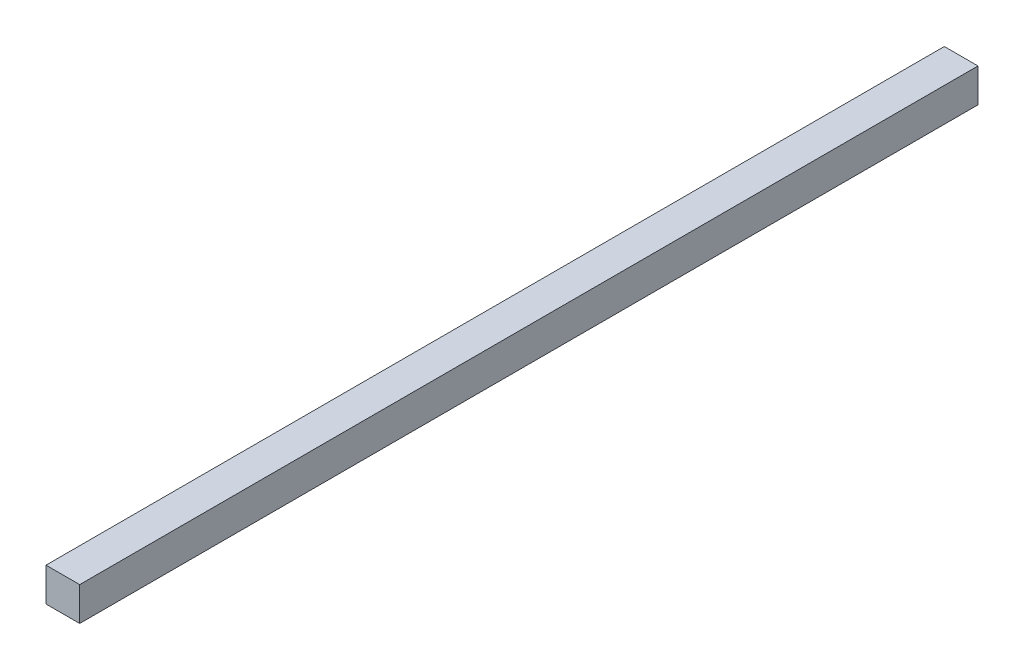
ISO-10303-21;
HEADER;
FILE_DESCRIPTION(('STEP AP214'),'2;1');
FILE_NAME('part.step','',(''),(''),'','','');
FILE_SCHEMA(('AUTOMOTIVE_DESIGN { 1 0 10303 214 1 1 1 1 }'));
ENDSEC;
DATA;
#1=APPLICATION_CONTEXT('core data for automotive mechanical design processes');
#2=APPLICATION_PROTOCOL_DEFINITION('international standard','automotive_design',2000,#1);
#3=PRODUCT_CONTEXT('',#1,'mechanical');
#4=PRODUCT('Part','Part','',(#3));
#5=PRODUCT_RELATED_PRODUCT_CATEGORY('part','',(#4));
#6=PRODUCT_DEFINITION_FORMATION('','',#4);
#7=PRODUCT_DEFINITION_CONTEXT('part definition',#1,'design');
#8=PRODUCT_DEFINITION('design','',#6,#7);
#9=PRODUCT_DEFINITION_SHAPE('','',#8);
#10=(LENGTH_UNIT() NAMED_UNIT(*) SI_UNIT(.MILLI.,.METRE.));
#11=(NAMED_UNIT(*) PLANE_ANGLE_UNIT() SI_UNIT($,.RADIAN.));
#12=(NAMED_UNIT(*) SI_UNIT($,.STERADIAN.) SOLID_ANGLE_UNIT());
#13=UNCERTAINTY_MEASURE_WITH_UNIT(LENGTH_MEASURE(1.E-05),#10,'distance_accuracy_value','');
#14=(GEOMETRIC_REPRESENTATION_CONTEXT(3) GLOBAL_UNCERTAINTY_ASSIGNED_CONTEXT((#13)) GLOBAL_UNIT_ASSIGNED_CONTEXT((#10,
#11,#12)) REPRESENTATION_CONTEXT('',''));
#15=CARTESIAN_POINT('',(0.,0.,0.));
#16=DIRECTION('',(0.,0.,1.));
#17=DIRECTION('',(1.,0.,0.));
#18=AXIS2_PLACEMENT_3D('',#15,#16,#17);
#19=CARTESIAN_POINT('',(7.5,-7.5,400.));
#20=DIRECTION('',(-1.,0.,0.));
#21=DIRECTION('',(0.,0.,1.));
#22=AXIS2_PLACEMENT_3D('',#19,#20,#21);
#23=PLANE('',#22);
#24=DIRECTION('',(0.,1.,0.));
#25=VECTOR('',#24,1.);
#26=CARTESIAN_POINT('',(7.5,-7.5,0.));
#27=LINE('',#26,#25);
#28=CARTESIAN_POINT('',(7.5,-7.5,0.));
#29=VERTEX_POINT('',#28);
#30=CARTESIAN_POINT('',(7.5,7.5,0.));
#31=VERTEX_POINT('',#30);
#32=EDGE_CURVE('E98',#29,#31,#27,.T.);
#33=ORIENTED_EDGE('',*,*,#32,.T.);
#34=DIRECTION('',(0.,0.,-1.));
#35=VECTOR('',#34,1.);
#36=CARTESIAN_POINT('',(7.5,7.5,400.));
#37=LINE('',#36,#35);
#38=CARTESIAN_POINT('',(7.5,7.5,400.));
#39=VERTEX_POINT('',#38);
#40=EDGE_CURVE('E11',#39,#31,#37,.T.);
#41=ORIENTED_EDGE('',*,*,#40,.F.);
#42=DIRECTION('',(0.,1.,0.));
#43=VECTOR('',#42,1.);
#44=CARTESIAN_POINT('',(7.5,-7.5,400.));
#45=LINE('',#44,#43);
#46=CARTESIAN_POINT('',(7.5,-7.5,400.));
#47=VERTEX_POINT('',#46);
#48=EDGE_CURVE('E86',#47,#39,#45,.T.);
#49=ORIENTED_EDGE('',*,*,#48,.F.);
#50=DIRECTION('',(0.,0.,-1.));
#51=VECTOR('',#50,1.);
#52=CARTESIAN_POINT('',(7.5,-7.5,400.));
#53=LINE('',#52,#51);
#54=EDGE_CURVE('E94',#47,#29,#53,.T.);
#55=ORIENTED_EDGE('',*,*,#54,.T.);
#56=EDGE_LOOP('',(#33,#41,#49,#55));
#57=FACE_BOUND('',#56,.T.);
#58=ADVANCED_FACE('F35',(#57),#23,.F.);
#59=CARTESIAN_POINT('',(-7.5,7.5,400.));
#60=DIRECTION('',(0.,-1.,0.));
#61=DIRECTION('',(0.,0.,-1.));
#62=AXIS2_PLACEMENT_3D('',#59,#60,#61);
#63=PLANE('',#62);
#64=DIRECTION('',(-1.,0.,0.));
#65=VECTOR('',#64,1.);
#66=CARTESIAN_POINT('',(-7.5,7.5,0.));
#67=LINE('',#66,#65);
#68=CARTESIAN_POINT('',(-7.5,7.5,0.));
#69=VERTEX_POINT('',#68);
#70=EDGE_CURVE('E90',#31,#69,#67,.T.);
#71=ORIENTED_EDGE('',*,*,#70,.T.);
#72=DIRECTION('',(0.,0.,-1.));
#73=VECTOR('',#72,1.);
#74=CARTESIAN_POINT('',(-7.5,7.5,400.));
#75=LINE('',#74,#73);
#76=CARTESIAN_POINT('',(-7.5,7.5,400.));
#77=VERTEX_POINT('',#76);
#78=EDGE_CURVE('E43',#77,#69,#75,.T.);
#79=ORIENTED_EDGE('',*,*,#78,.F.);
#80=DIRECTION('',(-1.,0.,0.));
#81=VECTOR('',#80,1.);
#82=CARTESIAN_POINT('',(-7.5,7.5,400.));
#83=LINE('',#82,#81);
#84=EDGE_CURVE('E81',#39,#77,#83,.T.);
#85=ORIENTED_EDGE('',*,*,#84,.F.);
#86=ORIENTED_EDGE('',*,*,#40,.T.);
#87=EDGE_LOOP('',(#71,#79,#85,#86));
#88=FACE_BOUND('',#87,.T.);
#89=ADVANCED_FACE('F89',(#88),#63,.F.);
#90=CARTESIAN_POINT('',(-7.5,-7.5,400.));
#91=DIRECTION('',(1.,0.,0.));
#92=DIRECTION('',(0.,0.,-1.));
#93=AXIS2_PLACEMENT_3D('',#90,#91,#92);
#94=PLANE('',#93);
#95=DIRECTION('',(0.,-1.,0.));
#96=VECTOR('',#95,1.);
#97=CARTESIAN_POINT('',(-7.5,-7.5,0.));
#98=LINE('',#97,#96);
#99=CARTESIAN_POINT('',(-7.5,-7.5,0.));
#100=VERTEX_POINT('',#99);
#101=EDGE_CURVE('E68',#69,#100,#98,.T.);
#102=ORIENTED_EDGE('',*,*,#101,.T.);
#103=DIRECTION('',(0.,0.,-1.));
#104=VECTOR('',#103,1.);
#105=CARTESIAN_POINT('',(-7.5,-7.5,400.));
#106=LINE('',#105,#104);
#107=CARTESIAN_POINT('',(-7.5,-7.5,400.));
#108=VERTEX_POINT('',#107);
#109=EDGE_CURVE('E91',#108,#100,#106,.T.);
#110=ORIENTED_EDGE('',*,*,#109,.F.);
#111=DIRECTION('',(0.,-1.,0.));
#112=VECTOR('',#111,1.);
#113=CARTESIAN_POINT('',(-7.5,-7.5,400.));
#114=LINE('',#113,#112);
#115=EDGE_CURVE('E84',#77,#108,#114,.T.);
#116=ORIENTED_EDGE('',*,*,#115,.F.);
#117=ORIENTED_EDGE('',*,*,#78,.T.);
#118=EDGE_LOOP('',(#102,#110,#116,#117));
#119=FACE_BOUND('',#118,.T.);
#120=ADVANCED_FACE('F92',(#119),#94,.F.);
#121=CARTESIAN_POINT('',(-7.5,-7.5,400.));
#122=DIRECTION('',(0.,1.,0.));
#123=DIRECTION('',(0.,0.,1.));
#124=AXIS2_PLACEMENT_3D('',#121,#122,#123);
#125=PLANE('',#124);
#126=DIRECTION('',(1.,0.,0.));
#127=VECTOR('',#126,1.);
#128=CARTESIAN_POINT('',(-7.5,-7.5,0.));
#129=LINE('',#128,#127);
#130=EDGE_CURVE('E74',#100,#29,#129,.T.);
#131=ORIENTED_EDGE('',*,*,#130,.T.);
#132=ORIENTED_EDGE('',*,*,#54,.F.);
#133=DIRECTION('',(1.,0.,0.));
#134=VECTOR('',#133,1.);
#135=CARTESIAN_POINT('',(-7.5,-7.5,400.));
#136=LINE('',#135,#134);
#137=EDGE_CURVE('E51',#108,#47,#136,.T.);
#138=ORIENTED_EDGE('',*,*,#137,.F.);
#139=ORIENTED_EDGE('',*,*,#109,.T.);
#140=EDGE_LOOP('',(#131,#132,#138,#139));
#141=FACE_BOUND('',#140,.T.);
#142=ADVANCED_FACE('F105',(#141),#125,.F.);
#143=CARTESIAN_POINT('',(0.,0.,400.));
#144=DIRECTION('',(0.,0.,-1.));
#145=DIRECTION('',(-1.,0.,0.));
#146=AXIS2_PLACEMENT_3D('',#143,#144,#145);
#147=PLANE('',#146);
#148=ORIENTED_EDGE('',*,*,#48,.T.);
#149=ORIENTED_EDGE('',*,*,#84,.T.);
#150=ORIENTED_EDGE('',*,*,#115,.T.);
#151=ORIENTED_EDGE('',*,*,#137,.T.);
#152=EDGE_LOOP('',(#148,#149,#150,#151));
#153=FACE_BOUND('',#152,.T.);
#154=ADVANCED_FACE('F82',(#153),#147,.F.);
#155=CARTESIAN_POINT('',(0.,0.,0.));
#156=DIRECTION('',(0.,0.,-1.));
#157=DIRECTION('',(-1.,0.,0.));
#158=AXIS2_PLACEMENT_3D('',#155,#156,#157);
#159=PLANE('',#158);
#160=ORIENTED_EDGE('',*,*,#32,.F.);
#161=ORIENTED_EDGE('',*,*,#130,.F.);
#162=ORIENTED_EDGE('',*,*,#101,.F.);
#163=ORIENTED_EDGE('',*,*,#70,.F.);
#164=EDGE_LOOP('',(#160,#161,#162,#163));
#165=FACE_BOUND('',#164,.T.);
#166=ADVANCED_FACE('F108',(#165),#159,.T.);
#167=CLOSED_SHELL('',(#58,#89,#120,#142,#154,#166));
#168=MANIFOLD_SOLID_BREP('B2',#167);
#169=ADVANCED_BREP_SHAPE_REPRESENTATION('',(#18,#168),#14);
#170=SHAPE_DEFINITION_REPRESENTATION(#9,#169);
ENDSEC;
END-ISO-10303-21;
